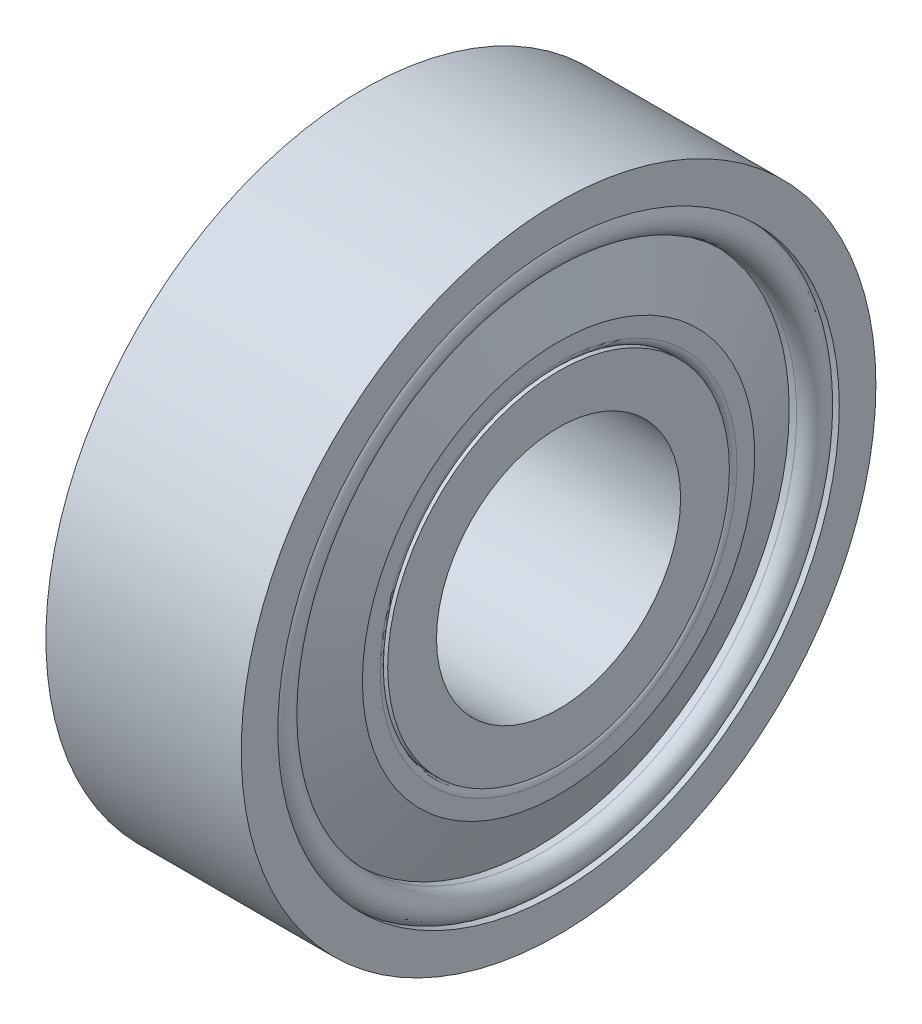
ISO-10303-21;
HEADER;
FILE_DESCRIPTION(('STEP AP214'),'2;1');
FILE_NAME('part.step','',(''),(''),'','','');
FILE_SCHEMA(('AUTOMOTIVE_DESIGN { 1 0 10303 214 1 1 1 1 }'));
ENDSEC;
DATA;
#1=APPLICATION_CONTEXT('core data for automotive mechanical design processes');
#2=APPLICATION_PROTOCOL_DEFINITION('international standard','automotive_design',2000,#1);
#3=PRODUCT_CONTEXT('',#1,'mechanical');
#4=PRODUCT('Part','Part','',(#3));
#5=PRODUCT_RELATED_PRODUCT_CATEGORY('part','',(#4));
#6=PRODUCT_DEFINITION_FORMATION('','',#4);
#7=PRODUCT_DEFINITION_CONTEXT('part definition',#1,'design');
#8=PRODUCT_DEFINITION('design','',#6,#7);
#9=PRODUCT_DEFINITION_SHAPE('','',#8);
#10=(LENGTH_UNIT() NAMED_UNIT(*) SI_UNIT(.MILLI.,.METRE.));
#11=(NAMED_UNIT(*) PLANE_ANGLE_UNIT() SI_UNIT($,.RADIAN.));
#12=(NAMED_UNIT(*) SI_UNIT($,.STERADIAN.) SOLID_ANGLE_UNIT());
#13=UNCERTAINTY_MEASURE_WITH_UNIT(LENGTH_MEASURE(1.E-05),#10,'distance_accuracy_value','');
#14=(GEOMETRIC_REPRESENTATION_CONTEXT(3) GLOBAL_UNCERTAINTY_ASSIGNED_CONTEXT((#13)) GLOBAL_UNIT_ASSIGNED_CONTEXT((#10,
#11,#12)) REPRESENTATION_CONTEXT('',''));
#15=CARTESIAN_POINT('',(0.,0.,0.));
#16=DIRECTION('',(0.,0.,1.));
#17=DIRECTION('',(1.,0.,0.));
#18=AXIS2_PLACEMENT_3D('',#15,#16,#17);
#19=CARTESIAN_POINT('',(-2.,0.,0.));
#20=DIRECTION('',(1.,0.,0.));
#21=DIRECTION('',(0.,0.,-1.));
#22=AXIS2_PLACEMENT_3D('',#19,#20,#21);
#23=CYLINDRICAL_SURFACE('',#22,2.5);
#24=CARTESIAN_POINT('',(-4.,0.,0.));
#25=DIRECTION('',(1.,0.,0.));
#26=DIRECTION('',(0.,0.,-1.));
#27=AXIS2_PLACEMENT_3D('',#24,#25,#26);
#28=CIRCLE('',#27,2.5);
#29=CARTESIAN_POINT('',(-4.,0.,-2.5));
#30=VERTEX_POINT('',#29);
#31=EDGE_CURVE('E259',#30,#30,#28,.T.);
#32=ORIENTED_EDGE('',*,*,#31,.F.);
#33=EDGE_LOOP('',(#32));
#34=FACE_BOUND('',#33,.T.);
#35=CARTESIAN_POINT('',(0.,0.,0.));
#36=DIRECTION('',(1.,0.,0.));
#37=DIRECTION('',(0.,0.,-1.));
#38=AXIS2_PLACEMENT_3D('',#35,#36,#37);
#39=CIRCLE('',#38,2.5);
#40=CARTESIAN_POINT('',(0.,0.,-2.5));
#41=VERTEX_POINT('',#40);
#42=EDGE_CURVE('E262',#41,#41,#39,.F.);
#43=ORIENTED_EDGE('',*,*,#42,.F.);
#44=EDGE_LOOP('',(#43));
#45=FACE_BOUND('',#44,.T.);
#46=ADVANCED_FACE('F17',(#34,#45),#23,.F.);
#47=CARTESIAN_POINT('',(0.,2.5,0.));
#48=DIRECTION('',(1.,0.,0.));
#49=DIRECTION('',(0.,0.,-1.));
#50=AXIS2_PLACEMENT_3D('',#47,#48,#49);
#51=PLANE('',#50);
#52=ORIENTED_EDGE('',*,*,#42,.T.);
#53=EDGE_LOOP('',(#52));
#54=FACE_BOUND('',#53,.T.);
#55=CARTESIAN_POINT('',(-9.20891496196917E-10,0.,0.));
#56=DIRECTION('',(1.,0.,0.));
#57=DIRECTION('',(0.,0.,-1.));
#58=AXIS2_PLACEMENT_3D('',#55,#56,#57);
#59=CIRCLE('',#58,3.5);
#60=CARTESIAN_POINT('',(-9.20891496196917E-10,0.,-3.5));
#61=VERTEX_POINT('',#60);
#62=EDGE_CURVE('E256',#61,#61,#59,.F.);
#63=ORIENTED_EDGE('',*,*,#62,.F.);
#64=EDGE_LOOP('',(#63));
#65=FACE_BOUND('',#64,.T.);
#66=ADVANCED_FACE('F353',(#54,#65),#51,.T.);
#67=CARTESIAN_POINT('',(-4.,3.5,0.));
#68=DIRECTION('',(-1.,0.,0.));
#69=DIRECTION('',(0.,0.,1.));
#70=AXIS2_PLACEMENT_3D('',#67,#68,#69);
#71=PLANE('',#70);
#72=ORIENTED_EDGE('',*,*,#31,.T.);
#73=EDGE_LOOP('',(#72));
#74=FACE_BOUND('',#73,.T.);
#75=CARTESIAN_POINT('',(-3.99999999908,0.,0.));
#76=DIRECTION('',(1.,0.,0.));
#77=DIRECTION('',(0.,0.,-1.));
#78=AXIS2_PLACEMENT_3D('',#75,#76,#77);
#79=CIRCLE('',#78,3.5);
#80=CARTESIAN_POINT('',(-3.99999999908,0.,-3.5));
#81=VERTEX_POINT('',#80);
#82=EDGE_CURVE('E252',#81,#81,#79,.T.);
#83=ORIENTED_EDGE('',*,*,#82,.F.);
#84=EDGE_LOOP('',(#83));
#85=FACE_BOUND('',#84,.T.);
#86=ADVANCED_FACE('F347',(#74,#85),#71,.T.);
#87=CARTESIAN_POINT('',(-0.0762,0.,0.));
#88=DIRECTION('',(1.,0.,0.));
#89=DIRECTION('',(0.,0.,-1.));
#90=AXIS2_PLACEMENT_3D('',#87,#88,#89);
#91=CYLINDRICAL_SURFACE('',#90,3.5);
#92=ORIENTED_EDGE('',*,*,#62,.T.);
#93=EDGE_LOOP('',(#92));
#94=FACE_BOUND('',#93,.T.);
#95=CARTESIAN_POINT('',(-0.1524,0.,0.));
#96=DIRECTION('',(1.,0.,0.));
#97=DIRECTION('',(0.,0.,-1.));
#98=AXIS2_PLACEMENT_3D('',#95,#96,#97);
#99=CIRCLE('',#98,3.5);
#100=CARTESIAN_POINT('',(-0.1524,0.,-3.5));
#101=VERTEX_POINT('',#100);
#102=EDGE_CURVE('E255',#101,#101,#99,.F.);
#103=ORIENTED_EDGE('',*,*,#102,.F.);
#104=EDGE_LOOP('',(#103));
#105=FACE_BOUND('',#104,.T.);
#106=ADVANCED_FACE('F345',(#94,#105),#91,.T.);
#107=CARTESIAN_POINT('',(-3.9238,0.,0.));
#108=DIRECTION('',(1.,0.,0.));
#109=DIRECTION('',(0.,0.,-1.));
#110=AXIS2_PLACEMENT_3D('',#107,#108,#109);
#111=CYLINDRICAL_SURFACE('',#110,3.5);
#112=CARTESIAN_POINT('',(-3.84760000092,0.,0.));
#113=DIRECTION('',(1.,0.,0.));
#114=DIRECTION('',(0.,0.,-1.));
#115=AXIS2_PLACEMENT_3D('',#112,#113,#114);
#116=CIRCLE('',#115,3.5);
#117=CARTESIAN_POINT('',(-3.84760000092,0.,-3.5));
#118=VERTEX_POINT('',#117);
#119=EDGE_CURVE('E67',#118,#118,#116,.T.);
#120=ORIENTED_EDGE('',*,*,#119,.F.);
#121=EDGE_LOOP('',(#120));
#122=FACE_BOUND('',#121,.T.);
#123=ORIENTED_EDGE('',*,*,#82,.T.);
#124=EDGE_LOOP('',(#123));
#125=FACE_BOUND('',#124,.T.);
#126=ADVANCED_FACE('F295',(#122,#125),#111,.T.);
#127=CARTESIAN_POINT('',(-0.1524,0.,0.));
#128=DIRECTION('',(1.,0.,0.));
#129=DIRECTION('',(0.,0.,-1.));
#130=AXIS2_PLACEMENT_3D('',#127,#128,#129);
#131=TOROIDAL_SURFACE('',#130,3.6524,0.1524);
#132=ORIENTED_EDGE('',*,*,#102,.T.);
#133=EDGE_LOOP('',(#132));
#134=FACE_BOUND('',#133,.T.);
#135=CARTESIAN_POINT('',(0.,0.,0.));
#136=DIRECTION('',(1.,0.,0.));
#137=DIRECTION('',(0.,0.,-1.));
#138=AXIS2_PLACEMENT_3D('',#135,#136,#137);
#139=CIRCLE('',#138,3.65240000002);
#140=CARTESIAN_POINT('',(0.,3.652400000005,0.));
#141=VERTEX_POINT('',#140);
#142=CARTESIAN_POINT('',(0.,0.,-3.652400000022));
#143=VERTEX_POINT('',#142);
#144=EDGE_CURVE('E58',#141,#143,#139,.F.);
#145=ORIENTED_EDGE('',*,*,#144,.F.);
#146=CARTESIAN_POINT('',(0.,0.,0.));
#147=DIRECTION('',(1.,0.,0.));
#148=DIRECTION('',(0.,1.,0.));
#149=AXIS2_PLACEMENT_3D('',#146,#147,#148);
#150=CIRCLE('',#149,3.6524);
#151=CARTESIAN_POINT('',(0.,0.,3.65240000001));
#152=VERTEX_POINT('',#151);
#153=EDGE_CURVE('E62',#152,#141,#150,.F.);
#154=ORIENTED_EDGE('',*,*,#153,.F.);
#155=CARTESIAN_POINT('',(0.,0.,3.65240000002));
#156=CARTESIAN_POINT('',(0.,-0.0597623156004069,3.65240126772725));
#157=CARTESIAN_POINT('',(0.,-0.119524523331374,3.65093325872832));
#158=CARTESIAN_POINT('',(0.,-0.238905024097582,3.64506778980043));
#159=CARTESIAN_POINT('',(0.,-0.298523317132823,3.64067032987147));
#160=CARTESIAN_POINT('',(0.,-0.417472289550725,3.62895506156589));
#161=CARTESIAN_POINT('',(0.,-0.476802968933385,3.62163725318926));
#162=CARTESIAN_POINT('',(0.,-0.595033800874569,3.60409931684475));
#163=CARTESIAN_POINT('',(0.,-0.653933953433093,3.59387918887687));
#164=CARTESIAN_POINT('',(0.,-0.77116183083911,3.57056112745678));
#165=CARTESIAN_POINT('',(0.,-0.829489555686605,3.55746319400457));
#166=CARTESIAN_POINT('',(0.,-0.945432062482005,3.5284211043758));
#167=CARTESIAN_POINT('',(0.,-1.00304684442991,3.51247694819925));
#168=CARTESIAN_POINT('',(0.,-1.11742466599229,3.47778081630284));
#169=CARTESIAN_POINT('',(0.,-1.17418770560675,3.45902884058298));
#170=CARTESIAN_POINT('',(0.,-1.28672529546917,3.41876224681185));
#171=CARTESIAN_POINT('',(0.,-1.34249984571711,3.39724762876059));
#172=CARTESIAN_POINT('',(0.,-1.45292609104254,3.35150758037405));
#173=CARTESIAN_POINT('',(0.,-1.50757778612002,3.32728215003877));
#174=CARTESIAN_POINT('',(0.,-1.61562666039142,3.27617883841568));
#175=CARTESIAN_POINT('',(0.,-1.66902383958534,3.24930095712786));
#176=CARTESIAN_POINT('',(0.,-1.77443504360596,3.1929574947303));
#177=CARTESIAN_POINT('',(0.,-1.82644906843265,3.16349191362055));
#178=CARTESIAN_POINT('',(0.,-1.92896865737763,3.10204403675553));
#179=CARTESIAN_POINT('',(0.,-1.97947422149592,3.07006174100025));
#180=CARTESIAN_POINT('',(0.,-2.07885521669623,3.00365748299311));
#181=CARTESIAN_POINT('',(0.,-2.12773064777825,2.96923552074124));
#182=CARTESIAN_POINT('',(0.,-2.22373363171159,2.89803485526375));
#183=CARTESIAN_POINT('',(0.,-2.27086118456292,2.86125615203813));
#184=CARTESIAN_POINT('',(0.,-2.36325487763216,2.78543060773043));
#185=CARTESIAN_POINT('',(0.,-2.40852101785008,2.74638376664836));
#186=CARTESIAN_POINT('',(0.,-2.49708283555588,2.66611601388807));
#187=CARTESIAN_POINT('',(0.,-2.54037851304376,2.62489510220986));
#188=CARTESIAN_POINT('',(0.,-2.62489510221016,2.54037851304405));
#189=CARTESIAN_POINT('',(0.,-2.66611601388868,2.49708283555645));
#190=CARTESIAN_POINT('',(0.,-2.74638376664961,2.40852101785118));
#191=CARTESIAN_POINT('',(0.,-2.78543060773202,2.36325487763351));
#192=CARTESIAN_POINT('',(0.,-2.86125615204042,2.27086118456473));
#193=CARTESIAN_POINT('',(0.,-2.8980348552664,2.22373363171362));
#194=CARTESIAN_POINT('',(0.,-2.96923552074463,2.12773064778067));
#195=CARTESIAN_POINT('',(0.,-3.00365748299688,2.07885521669884));
#196=CARTESIAN_POINT('',(0.,-3.07006174100481,1.97947422149886));
#197=CARTESIAN_POINT('',(0.,-3.10204403676049,1.92896865738071));
#198=CARTESIAN_POINT('',(0.,-3.16349191362633,1.82644906843598));
#199=CARTESIAN_POINT('',(0.,-3.19295749473649,1.7744350436094));
#200=CARTESIAN_POINT('',(0.,-3.24930095713491,1.66902383958896));
#201=CARTESIAN_POINT('',(0.,-3.27617883842316,1.61562666039511));
#202=CARTESIAN_POINT('',(0.,-3.32728215004713,1.5075777861238));
#203=CARTESIAN_POINT('',(0.,-3.35150758038284,1.45292609104635));
#204=CARTESIAN_POINT('',(0.,-3.39724762877028,1.34249984572094));
#205=CARTESIAN_POINT('',(0.,-3.41876224682199,1.28672529547298));
#206=CARTESIAN_POINT('',(0.,-3.45902884059403,1.1741877056105));
#207=CARTESIAN_POINT('',(0.,-3.47778081631435,1.11742466599598));
#208=CARTESIAN_POINT('',(0.,-3.51247694821167,1.00304684443345));
#209=CARTESIAN_POINT('',(0.,-3.52842110438868,0.945432062485454));
#210=CARTESIAN_POINT('',(0.,-3.55746319401836,0.829489555689819));
#211=CARTESIAN_POINT('',(0.,-3.57056112747104,0.771161830842185));
#212=CARTESIAN_POINT('',(0.,-3.59387918889204,0.653933953435849));
#213=CARTESIAN_POINT('',(0.,-3.60409931686037,0.595033800877147));
#214=CARTESIAN_POINT('',(0.,-3.62163725320578,0.47680296893556));
#215=CARTESIAN_POINT('',(0.,-3.62895506158286,0.417472289552676));
#216=CARTESIAN_POINT('',(0.,-3.64067032988933,0.298523317134286));
#217=CARTESIAN_POINT('',(0.,-3.64506778981872,0.238905024098781));
#218=CARTESIAN_POINT('',(0.,-3.65093325874748,0.119524523332001));
#219=CARTESIAN_POINT('',(0.,-3.65240126774683,0.059762315600726));
#220=CARTESIAN_POINT('',(0.,-3.65240000004,0.));
#221=B_SPLINE_CURVE_WITH_KNOTS('',3,(#155,#156,#157,#158,#159,#160,#161,#162,#163,#164,#165,
#166,#167,#168,#169,#170,#171,#172,#173,#174,#175,#176,#177,#178,#179,#180,#181,#182,#183,#184,
#185,#186,#187,#188,#189,#190,#191,#192,#193,#194,#195,#196,#197,#198,#199,#200,#201,#202,#203,
#204,#205,#206,#207,#208,#209,#210,#211,#212,#213,#214,#215,#216,#217,#218,#219,#220),
.UNSPECIFIED.,.F.,.F.,(4,2,2,2,2,2,2,2,2,2,2,2,2,2,2,2,2,2,2,2,2,2,2,2,2,2,2,2,2,2,2,2,4),(0.,
0.179268766115166,0.358537532230363,0.537806298345592,0.717075064460851,0.89634383057614,
1.07561259669146,1.25488136280681,1.43415012892219,1.6134188950376,1.79268766115305,
1.97195642726852,2.15122519338402,2.33049395949956,2.50976272561513,2.68903149173072,
2.86830025784635,3.047569023962,3.22683779007769,3.40610655619341,3.58537532230916,
3.76464408842494,3.94391285454075,4.12318162065659,4.30245038677246,4.48171915288837,
4.6609879190043,4.84025668512027,5.01952545123626,5.19879421735229,5.37806298346834,
5.55733174958443,5.73660051570055),.UNSPECIFIED.);
#222=CARTESIAN_POINT('',(0.,-3.6524000000325,0.));
#223=VERTEX_POINT('',#222);
#224=EDGE_CURVE('E73',#223,#152,#221,.F.);
#225=ORIENTED_EDGE('',*,*,#224,.F.);
#226=CARTESIAN_POINT('',(0.,-3.65240000004,0.));
#227=CARTESIAN_POINT('',(0.,-3.65240126774683,-0.0597623156007237));
#228=CARTESIAN_POINT('',(0.,-3.65093325874748,-0.119524523331997));
#229=CARTESIAN_POINT('',(0.,-3.64506778981872,-0.238905024098777));
#230=CARTESIAN_POINT('',(0.,-3.64067032988933,-0.298523317134284));
#231=CARTESIAN_POINT('',(0.,-3.62895506158286,-0.417472289552673));
#232=CARTESIAN_POINT('',(0.,-3.62163725320578,-0.476802968935557));
#233=CARTESIAN_POINT('',(0.,-3.60409931686037,-0.595033800877144));
#234=CARTESIAN_POINT('',(0.,-3.59387918889204,-0.653933953435849));
#235=CARTESIAN_POINT('',(0.,-3.57056112747104,-0.771161830842186));
#236=CARTESIAN_POINT('',(0.,-3.55746319401836,-0.829489555689819));
#237=CARTESIAN_POINT('',(0.,-3.52842110438868,-0.945432062485452));
#238=CARTESIAN_POINT('',(0.,-3.51247694821168,-1.00304684443345));
#239=CARTESIAN_POINT('',(0.,-3.47778081631435,-1.11742466599598));
#240=CARTESIAN_POINT('',(0.,-3.45902884059403,-1.1741877056105));
#241=CARTESIAN_POINT('',(0.,-3.41876224682199,-1.28672529547298));
#242=CARTESIAN_POINT('',(0.,-3.39724762877028,-1.34249984572094));
#243=CARTESIAN_POINT('',(0.,-3.35150758038284,-1.45292609104635));
#244=CARTESIAN_POINT('',(0.,-3.32728215004713,-1.5075777861238));
#245=CARTESIAN_POINT('',(0.,-3.27617883842316,-1.61562666039511));
#246=CARTESIAN_POINT('',(0.,-3.24930095713491,-1.66902383958896));
#247=CARTESIAN_POINT('',(0.,-3.19295749473649,-1.7744350436094));
#248=CARTESIAN_POINT('',(0.,-3.16349191362633,-1.82644906843598));
#249=CARTESIAN_POINT('',(0.,-3.10204403676049,-1.92896865738071));
#250=CARTESIAN_POINT('',(0.,-3.07006174100481,-1.97947422149886));
#251=CARTESIAN_POINT('',(0.,-3.00365748299688,-2.07885521669884));
#252=CARTESIAN_POINT('',(0.,-2.96923552074463,-2.12773064778067));
#253=CARTESIAN_POINT('',(0.,-2.8980348552664,-2.22373363171362));
#254=CARTESIAN_POINT('',(0.,-2.86125615204042,-2.27086118456473));
#255=CARTESIAN_POINT('',(0.,-2.78543060773203,-2.36325487763351));
#256=CARTESIAN_POINT('',(0.,-2.74638376664962,-2.40852101785118));
#257=CARTESIAN_POINT('',(0.,-2.66611601388868,-2.49708283555645));
#258=CARTESIAN_POINT('',(0.,-2.62489510221017,-2.54037851304405));
#259=CARTESIAN_POINT('',(0.,-2.54037851304376,-2.62489510220986));
#260=CARTESIAN_POINT('',(0.,-2.49708283555588,-2.66611601388807));
#261=CARTESIAN_POINT('',(0.,-2.40852101785008,-2.74638376664836));
#262=CARTESIAN_POINT('',(0.,-2.36325487763216,-2.78543060773043));
#263=CARTESIAN_POINT('',(0.,-2.27086118456292,-2.86125615203813));
#264=CARTESIAN_POINT('',(0.,-2.22373363171159,-2.89803485526375));
#265=CARTESIAN_POINT('',(0.,-2.12773064777825,-2.96923552074124));
#266=CARTESIAN_POINT('',(0.,-2.07885521669623,-3.00365748299311));
#267=CARTESIAN_POINT('',(0.,-1.97947422149592,-3.07006174100025));
#268=CARTESIAN_POINT('',(0.,-1.92896865737764,-3.10204403675553));
#269=CARTESIAN_POINT('',(0.,-1.82644906843265,-3.16349191362055));
#270=CARTESIAN_POINT('',(0.,-1.77443504360596,-3.1929574947303));
#271=CARTESIAN_POINT('',(0.,-1.66902383958535,-3.24930095712786));
#272=CARTESIAN_POINT('',(0.,-1.61562666039143,-3.27617883841568));
#273=CARTESIAN_POINT('',(0.,-1.50757778612002,-3.32728215003877));
#274=CARTESIAN_POINT('',(0.,-1.45292609104254,-3.35150758037405));
#275=CARTESIAN_POINT('',(0.,-1.34249984571711,-3.39724762876059));
#276=CARTESIAN_POINT('',(0.,-1.28672529546917,-3.41876224681185));
#277=CARTESIAN_POINT('',(0.,-1.17418770560675,-3.45902884058298));
#278=CARTESIAN_POINT('',(0.,-1.11742466599229,-3.47778081630284));
#279=CARTESIAN_POINT('',(0.,-1.00304684442991,-3.51247694819925));
#280=CARTESIAN_POINT('',(0.,-0.945432062482006,-3.5284211043758));
#281=CARTESIAN_POINT('',(0.,-0.829489555686606,-3.55746319400457));
#282=CARTESIAN_POINT('',(0.,-0.771161830839112,-3.57056112745678));
#283=CARTESIAN_POINT('',(0.,-0.653933953433093,-3.59387918887687));
#284=CARTESIAN_POINT('',(0.,-0.59503380087457,-3.60409931684475));
#285=CARTESIAN_POINT('',(0.,-0.476802968933387,-3.62163725318926));
#286=CARTESIAN_POINT('',(0.,-0.417472289550728,-3.62895506156589));
#287=CARTESIAN_POINT('',(0.,-0.298523317132826,-3.64067032987147));
#288=CARTESIAN_POINT('',(0.,-0.238905024097584,-3.64506778980043));
#289=CARTESIAN_POINT('',(0.,-0.119524523331375,-3.65093325872832));
#290=CARTESIAN_POINT('',(0.,-0.0597623156004082,-3.65240126772725));
#291=CARTESIAN_POINT('',(0.,0.,-3.65240000002));
#292=B_SPLINE_CURVE_WITH_KNOTS('',3,(#226,#227,#228,#229,#230,#231,#232,#233,#234,#235,#236,
#237,#238,#239,#240,#241,#242,#243,#244,#245,#246,#247,#248,#249,#250,#251,#252,#253,#254,#255,
#256,#257,#258,#259,#260,#261,#262,#263,#264,#265,#266,#267,#268,#269,#270,#271,#272,#273,#274,
#275,#276,#277,#278,#279,#280,#281,#282,#283,#284,#285,#286,#287,#288,#289,#290,#291),
.UNSPECIFIED.,.F.,.F.,(4,2,2,2,2,2,2,2,2,2,2,2,2,2,2,2,2,2,2,2,2,2,2,2,2,2,2,2,2,2,2,2,4),(0.,
0.179268766116117,0.358537532232203,0.537806298348259,0.717075064464287,0.896343830580282,
1.07561259669625,1.25488136281218,1.43415012892808,1.61341889504396,1.7926876611598,
1.97195642727561,2.15122519339139,2.33049395950714,2.50976272562285,2.68903149173854,
2.8683002578542,3.04756902396983,3.22683779008543,3.40610655620099,3.58537532231653,
3.76464408843203,3.9439128545475,4.12318162066294,4.30245038677836,4.48171915289374,
4.66098791900909,4.84025668512441,5.0195254512397,5.19879421735496,5.37806298347018,
5.55733174958538,5.73660051570055),.UNSPECIFIED.);
#293=EDGE_CURVE('E55',#143,#223,#292,.F.);
#294=ORIENTED_EDGE('',*,*,#293,.F.);
#295=EDGE_LOOP('',(#145,#154,#225,#294));
#296=FACE_BOUND('',#295,.T.);
#297=ADVANCED_FACE('F61',(#134,#296),#131,.T.);
#298=CARTESIAN_POINT('',(-3.8476,0.,0.));
#299=DIRECTION('',(1.,0.,0.));
#300=DIRECTION('',(0.,0.,-1.));
#301=AXIS2_PLACEMENT_3D('',#298,#299,#300);
#302=TOROIDAL_SURFACE('',#301,3.6524,0.1524);
#303=CARTESIAN_POINT('',(-4.,0.,0.));
#304=DIRECTION('',(-1.,0.,0.));
#305=DIRECTION('',(0.,-1.,0.));
#306=AXIS2_PLACEMENT_3D('',#303,#304,#305);
#307=CIRCLE('',#306,3.6524);
#308=CARTESIAN_POINT('',(-4.,0.,3.6524));
#309=VERTEX_POINT('',#308);
#310=CARTESIAN_POINT('',(-4.,-3.6524,0.));
#311=VERTEX_POINT('',#310);
#312=EDGE_CURVE('E151',#309,#311,#307,.F.);
#313=ORIENTED_EDGE('',*,*,#312,.F.);
#314=CARTESIAN_POINT('',(-4.,0.,0.));
#315=DIRECTION('',(-1.,0.,0.));
#316=DIRECTION('',(0.,0.,1.));
#317=AXIS2_PLACEMENT_3D('',#314,#315,#316);
#318=CIRCLE('',#317,3.6524);
#319=CARTESIAN_POINT('',(-4.,3.6524,0.));
#320=VERTEX_POINT('',#319);
#321=EDGE_CURVE('E75',#320,#309,#318,.F.);
#322=ORIENTED_EDGE('',*,*,#321,.F.);
#323=CARTESIAN_POINT('',(-4.,0.,0.));
#324=DIRECTION('',(-1.,0.,0.));
#325=DIRECTION('',(0.,1.,0.));
#326=AXIS2_PLACEMENT_3D('',#323,#324,#325);
#327=CIRCLE('',#326,3.6524);
#328=CARTESIAN_POINT('',(-4.,0.,-3.6524));
#329=VERTEX_POINT('',#328);
#330=EDGE_CURVE('E37',#329,#320,#327,.F.);
#331=ORIENTED_EDGE('',*,*,#330,.F.);
#332=CARTESIAN_POINT('',(-4.,0.,0.));
#333=DIRECTION('',(-1.,0.,0.));
#334=DIRECTION('',(0.,0.,-1.));
#335=AXIS2_PLACEMENT_3D('',#332,#333,#334);
#336=CIRCLE('',#335,3.6524);
#337=EDGE_CURVE('E141',#311,#329,#336,.F.);
#338=ORIENTED_EDGE('',*,*,#337,.F.);
#339=EDGE_LOOP('',(#313,#322,#331,#338));
#340=FACE_BOUND('',#339,.T.);
#341=ORIENTED_EDGE('',*,*,#119,.T.);
#342=EDGE_LOOP('',(#341));
#343=FACE_BOUND('',#342,.T.);
#344=ADVANCED_FACE('F95',(#340,#343),#302,.T.);
#345=CARTESIAN_POINT('',(0.,3.6524,0.));
#346=DIRECTION('',(1.,0.,0.));
#347=DIRECTION('',(0.,0.,-1.));
#348=AXIS2_PLACEMENT_3D('',#345,#346,#347);
#349=PLANE('',#348);
#350=ORIENTED_EDGE('',*,*,#224,.T.);
#351=ORIENTED_EDGE('',*,*,#153,.T.);
#352=ORIENTED_EDGE('',*,*,#144,.T.);
#353=ORIENTED_EDGE('',*,*,#293,.T.);
#354=EDGE_LOOP('',(#350,#351,#352,#353));
#355=FACE_BOUND('',#354,.T.);
#356=CARTESIAN_POINT('',(-6.09341678677044E-11,0.,0.));
#357=DIRECTION('',(-1.,0.,0.));
#358=DIRECTION('',(0.,0.,1.));
#359=AXIS2_PLACEMENT_3D('',#356,#357,#358);
#360=CIRCLE('',#359,4.01784895188939);
#361=CARTESIAN_POINT('',(-6.09341678677044E-11,0.,4.01784895188939));
#362=VERTEX_POINT('',#361);
#363=EDGE_CURVE('E250',#362,#362,#360,.T.);
#364=ORIENTED_EDGE('',*,*,#363,.F.);
#365=EDGE_LOOP('',(#364));
#366=FACE_BOUND('',#365,.T.);
#367=ADVANCED_FACE('F71',(#355,#366),#349,.T.);
#368=CARTESIAN_POINT('',(-4.,4.01784895193,0.));
#369=DIRECTION('',(-1.,0.,0.));
#370=DIRECTION('',(0.,0.,1.));
#371=AXIS2_PLACEMENT_3D('',#368,#369,#370);
#372=PLANE('',#371);
#373=ORIENTED_EDGE('',*,*,#337,.T.);
#374=ORIENTED_EDGE('',*,*,#330,.T.);
#375=ORIENTED_EDGE('',*,*,#321,.T.);
#376=ORIENTED_EDGE('',*,*,#312,.T.);
#377=EDGE_LOOP('',(#373,#374,#375,#376));
#378=FACE_BOUND('',#377,.T.);
#379=CARTESIAN_POINT('',(-3.99999999995817,0.,0.));
#380=DIRECTION('',(1.,0.,0.));
#381=DIRECTION('',(0.,0.,-1.));
#382=AXIS2_PLACEMENT_3D('',#379,#380,#381);
#383=CIRCLE('',#382,4.01784895188939);
#384=CARTESIAN_POINT('',(-3.99999999995817,0.,-4.01784895188939));
#385=VERTEX_POINT('',#384);
#386=EDGE_CURVE('E165',#385,#385,#383,.T.);
#387=ORIENTED_EDGE('',*,*,#386,.F.);
#388=EDGE_LOOP('',(#387));
#389=FACE_BOUND('',#388,.T.);
#390=ADVANCED_FACE('F94',(#378,#389),#372,.T.);
#391=CARTESIAN_POINT('',(-0.457199999885916,0.,0.));
#392=DIRECTION('',(-1.,0.,0.));
#393=DIRECTION('',(0.,0.,1.));
#394=AXIS2_PLACEMENT_3D('',#391,#392,#393);
#395=CONICAL_SURFACE('',#394,5.18123545651861,1.19634707304665);
#396=ORIENTED_EDGE('',*,*,#363,.T.);
#397=EDGE_LOOP('',(#396));
#398=FACE_BOUND('',#397,.T.);
#399=CARTESIAN_POINT('',(-0.457199999079,0.,0.));
#400=DIRECTION('',(1.,0.,0.));
#401=DIRECTION('',(0.,0.,-1.));
#402=AXIS2_PLACEMENT_3D('',#399,#400,#401);
#403=CIRCLE('',#402,5.18123545693);
#404=CARTESIAN_POINT('',(-0.457199999079,0.,-5.18123545693));
#405=VERTEX_POINT('',#404);
#406=EDGE_CURVE('E161',#405,#405,#403,.T.);
#407=ORIENTED_EDGE('',*,*,#406,.T.);
#408=EDGE_LOOP('',(#407));
#409=FACE_BOUND('',#408,.T.);
#410=ADVANCED_FACE('F197',(#398,#409),#395,.T.);
#411=CARTESIAN_POINT('',(-3.54280000004792,0.,0.));
#412=DIRECTION('',(1.,0.,0.));
#413=DIRECTION('',(0.,0.,-1.));
#414=AXIS2_PLACEMENT_3D('',#411,#412,#413);
#415=CONICAL_SURFACE('',#414,5.18123545668914,1.19634707303306);
#416=CARTESIAN_POINT('',(-3.5428,0.,0.));
#417=DIRECTION('',(1.,0.,0.));
#418=DIRECTION('',(0.,0.,-1.));
#419=AXIS2_PLACEMENT_3D('',#416,#417,#418);
#420=CIRCLE('',#419,5.18123545693);
#421=CARTESIAN_POINT('',(-3.5428,0.,-5.18123545693));
#422=VERTEX_POINT('',#421);
#423=EDGE_CURVE('E164',#422,#422,#420,.F.);
#424=ORIENTED_EDGE('',*,*,#423,.T.);
#425=EDGE_LOOP('',(#424));
#426=FACE_BOUND('',#425,.T.);
#427=ORIENTED_EDGE('',*,*,#386,.T.);
#428=EDGE_LOOP('',(#427));
#429=FACE_BOUND('',#428,.T.);
#430=ADVANCED_FACE('F194',(#426,#429),#415,.T.);
#431=CARTESIAN_POINT('',(-0.381,0.,0.));
#432=DIRECTION('',(1.,0.,0.));
#433=DIRECTION('',(0.,0.,-1.));
#434=AXIS2_PLACEMENT_3D('',#431,#432,#433);
#435=CYLINDRICAL_SURFACE('',#434,5.18123545693);
#436=ORIENTED_EDGE('',*,*,#406,.F.);
#437=EDGE_LOOP('',(#436));
#438=FACE_BOUND('',#437,.T.);
#439=CARTESIAN_POINT('',(-0.3048,0.,0.));
#440=DIRECTION('',(1.,0.,0.));
#441=DIRECTION('',(0.,0.,1.));
#442=AXIS2_PLACEMENT_3D('',#439,#440,#441);
#443=CIRCLE('',#442,5.18123545693);
#444=CARTESIAN_POINT('',(-0.3048,0.,5.18123545693));
#445=VERTEX_POINT('',#444);
#446=EDGE_CURVE('E168',#445,#445,#443,.F.);
#447=ORIENTED_EDGE('',*,*,#446,.F.);
#448=EDGE_LOOP('',(#447));
#449=FACE_BOUND('',#448,.T.);
#450=ADVANCED_FACE('F190',(#438,#449),#435,.F.);
#451=CARTESIAN_POINT('',(-3.619,0.,0.));
#452=DIRECTION('',(1.,0.,0.));
#453=DIRECTION('',(0.,0.,-1.));
#454=AXIS2_PLACEMENT_3D('',#451,#452,#453);
#455=CYLINDRICAL_SURFACE('',#454,5.18123545693);
#456=CARTESIAN_POINT('',(-3.69519999908,0.,0.));
#457=DIRECTION('',(1.,0.,0.));
#458=DIRECTION('',(0.,0.,1.));
#459=AXIS2_PLACEMENT_3D('',#456,#457,#458);
#460=CIRCLE('',#459,5.18123545693);
#461=CARTESIAN_POINT('',(-3.69519999908,0.,5.18123545693));
#462=VERTEX_POINT('',#461);
#463=EDGE_CURVE('E171',#462,#462,#460,.T.);
#464=ORIENTED_EDGE('',*,*,#463,.F.);
#465=EDGE_LOOP('',(#464));
#466=FACE_BOUND('',#465,.T.);
#467=ORIENTED_EDGE('',*,*,#423,.F.);
#468=EDGE_LOOP('',(#467));
#469=FACE_BOUND('',#468,.T.);
#470=ADVANCED_FACE('F184',(#466,#469),#455,.F.);
#471=CARTESIAN_POINT('',(-0.3048,0.,0.));
#472=DIRECTION('',(1.,0.,0.));
#473=DIRECTION('',(0.,0.,1.));
#474=AXIS2_PLACEMENT_3D('',#471,#472,#473);
#475=TOROIDAL_SURFACE('',#474,5.48603545693,0.3048);
#476=ORIENTED_EDGE('',*,*,#446,.T.);
#477=EDGE_LOOP('',(#476));
#478=FACE_BOUND('',#477,.T.);
#479=CARTESIAN_POINT('',(-0.152399999079,0.,0.));
#480=DIRECTION('',(1.,0.,0.));
#481=DIRECTION('',(0.,0.,-1.));
#482=AXIS2_PLACEMENT_3D('',#479,#480,#481);
#483=CIRCLE('',#482,5.75);
#484=CARTESIAN_POINT('',(-0.152399999079,0.,-5.75));
#485=VERTEX_POINT('',#484);
#486=EDGE_CURVE('E174',#485,#485,#483,.T.);
#487=ORIENTED_EDGE('',*,*,#486,.T.);
#488=EDGE_LOOP('',(#487));
#489=FACE_BOUND('',#488,.T.);
#490=ADVANCED_FACE('F179',(#478,#489),#475,.T.);
#491=CARTESIAN_POINT('',(-3.6952,0.,0.));
#492=DIRECTION('',(1.,0.,0.));
#493=DIRECTION('',(0.,0.,1.));
#494=AXIS2_PLACEMENT_3D('',#491,#492,#493);
#495=TOROIDAL_SURFACE('',#494,5.48603545693,0.3048);
#496=CARTESIAN_POINT('',(-3.8476,0.,0.));
#497=DIRECTION('',(1.,0.,0.));
#498=DIRECTION('',(0.,0.,-1.));
#499=AXIS2_PLACEMENT_3D('',#496,#497,#498);
#500=CIRCLE('',#499,5.75);
#501=CARTESIAN_POINT('',(-3.8476,0.,-5.75));
#502=VERTEX_POINT('',#501);
#503=EDGE_CURVE('E241',#502,#502,#500,.F.);
#504=ORIENTED_EDGE('',*,*,#503,.T.);
#505=EDGE_LOOP('',(#504));
#506=FACE_BOUND('',#505,.T.);
#507=ORIENTED_EDGE('',*,*,#463,.T.);
#508=EDGE_LOOP('',(#507));
#509=FACE_BOUND('',#508,.T.);
#510=ADVANCED_FACE('F183',(#506,#509),#495,.T.);
#511=CARTESIAN_POINT('',(-0.0762,0.,0.));
#512=DIRECTION('',(1.,0.,0.));
#513=DIRECTION('',(0.,0.,-1.));
#514=AXIS2_PLACEMENT_3D('',#511,#512,#513);
#515=CYLINDRICAL_SURFACE('',#514,5.75);
#516=ORIENTED_EDGE('',*,*,#486,.F.);
#517=EDGE_LOOP('',(#516));
#518=FACE_BOUND('',#517,.T.);
#519=CARTESIAN_POINT('',(0.,0.,0.));
#520=DIRECTION('',(1.,0.,0.));
#521=DIRECTION('',(0.,0.,-1.));
#522=AXIS2_PLACEMENT_3D('',#519,#520,#521);
#523=CIRCLE('',#522,5.75);
#524=CARTESIAN_POINT('',(0.,0.,-5.75));
#525=VERTEX_POINT('',#524);
#526=EDGE_CURVE('E239',#525,#525,#523,.F.);
#527=ORIENTED_EDGE('',*,*,#526,.F.);
#528=EDGE_LOOP('',(#527));
#529=FACE_BOUND('',#528,.T.);
#530=ADVANCED_FACE('F226',(#518,#529),#515,.F.);
#531=CARTESIAN_POINT('',(-3.9238,0.,0.));
#532=DIRECTION('',(1.,0.,0.));
#533=DIRECTION('',(0.,0.,-1.));
#534=AXIS2_PLACEMENT_3D('',#531,#532,#533);
#535=CYLINDRICAL_SURFACE('',#534,5.75);
#536=CARTESIAN_POINT('',(-3.99999999908,0.,0.));
#537=DIRECTION('',(1.,0.,0.));
#538=DIRECTION('',(0.,0.,-1.));
#539=AXIS2_PLACEMENT_3D('',#536,#537,#538);
#540=CIRCLE('',#539,5.75);
#541=CARTESIAN_POINT('',(-3.99999999908,0.,-5.75));
#542=VERTEX_POINT('',#541);
#543=EDGE_CURVE('E240',#542,#542,#540,.T.);
#544=ORIENTED_EDGE('',*,*,#543,.F.);
#545=EDGE_LOOP('',(#544));
#546=FACE_BOUND('',#545,.T.);
#547=ORIENTED_EDGE('',*,*,#503,.F.);
#548=EDGE_LOOP('',(#547));
#549=FACE_BOUND('',#548,.T.);
#550=ADVANCED_FACE('F223',(#546,#549),#535,.F.);
#551=CARTESIAN_POINT('',(0.,5.75,0.));
#552=DIRECTION('',(1.,0.,0.));
#553=DIRECTION('',(0.,0.,-1.));
#554=AXIS2_PLACEMENT_3D('',#551,#552,#553);
#555=PLANE('',#554);
#556=ORIENTED_EDGE('',*,*,#526,.T.);
#557=EDGE_LOOP('',(#556));
#558=FACE_BOUND('',#557,.T.);
#559=CARTESIAN_POINT('',(0.,0.,0.));
#560=DIRECTION('',(1.,0.,0.));
#561=DIRECTION('',(0.,0.,-1.));
#562=AXIS2_PLACEMENT_3D('',#559,#560,#561);
#563=CIRCLE('',#562,6.5);
#564=CARTESIAN_POINT('',(0.,0.,-6.5));
#565=VERTEX_POINT('',#564);
#566=EDGE_CURVE('E28',#565,#565,#563,.F.);
#567=ORIENTED_EDGE('',*,*,#566,.F.);
#568=EDGE_LOOP('',(#567));
#569=FACE_BOUND('',#568,.T.);
#570=ADVANCED_FACE('F215',(#558,#569),#555,.T.);
#571=CARTESIAN_POINT('',(-4.,6.5,0.));
#572=DIRECTION('',(-1.,0.,0.));
#573=DIRECTION('',(0.,0.,1.));
#574=AXIS2_PLACEMENT_3D('',#571,#572,#573);
#575=PLANE('',#574);
#576=ORIENTED_EDGE('',*,*,#543,.T.);
#577=EDGE_LOOP('',(#576));
#578=FACE_BOUND('',#577,.T.);
#579=CARTESIAN_POINT('',(-4.,0.,0.));
#580=DIRECTION('',(1.,0.,0.));
#581=DIRECTION('',(0.,0.,-1.));
#582=AXIS2_PLACEMENT_3D('',#579,#580,#581);
#583=CIRCLE('',#582,6.5);
#584=CARTESIAN_POINT('',(-4.,0.,-6.5));
#585=VERTEX_POINT('',#584);
#586=EDGE_CURVE('E11',#585,#585,#583,.T.);
#587=ORIENTED_EDGE('',*,*,#586,.F.);
#588=EDGE_LOOP('',(#587));
#589=FACE_BOUND('',#588,.T.);
#590=ADVANCED_FACE('F209',(#578,#589),#575,.T.);
#591=CARTESIAN_POINT('',(-2.,0.,0.));
#592=DIRECTION('',(1.,0.,0.));
#593=DIRECTION('',(0.,0.,-1.));
#594=AXIS2_PLACEMENT_3D('',#591,#592,#593);
#595=CYLINDRICAL_SURFACE('',#594,6.5);
#596=ORIENTED_EDGE('',*,*,#566,.T.);
#597=EDGE_LOOP('',(#596));
#598=FACE_BOUND('',#597,.T.);
#599=ORIENTED_EDGE('',*,*,#586,.T.);
#600=EDGE_LOOP('',(#599));
#601=FACE_BOUND('',#600,.T.);
#602=ADVANCED_FACE('F207',(#598,#601),#595,.T.);
#603=CLOSED_SHELL('',(#46,#66,#86,#106,#126,#297,#344,#367,#390,#410,#430,#450,#470,#490,#510,
#530,#550,#570,#590,#602));
#604=MANIFOLD_SOLID_BREP('B1',#603);
#605=ADVANCED_BREP_SHAPE_REPRESENTATION('',(#18,#604),#14);
#606=SHAPE_DEFINITION_REPRESENTATION(#9,#605);
ENDSEC;
END-ISO-10303-21;
